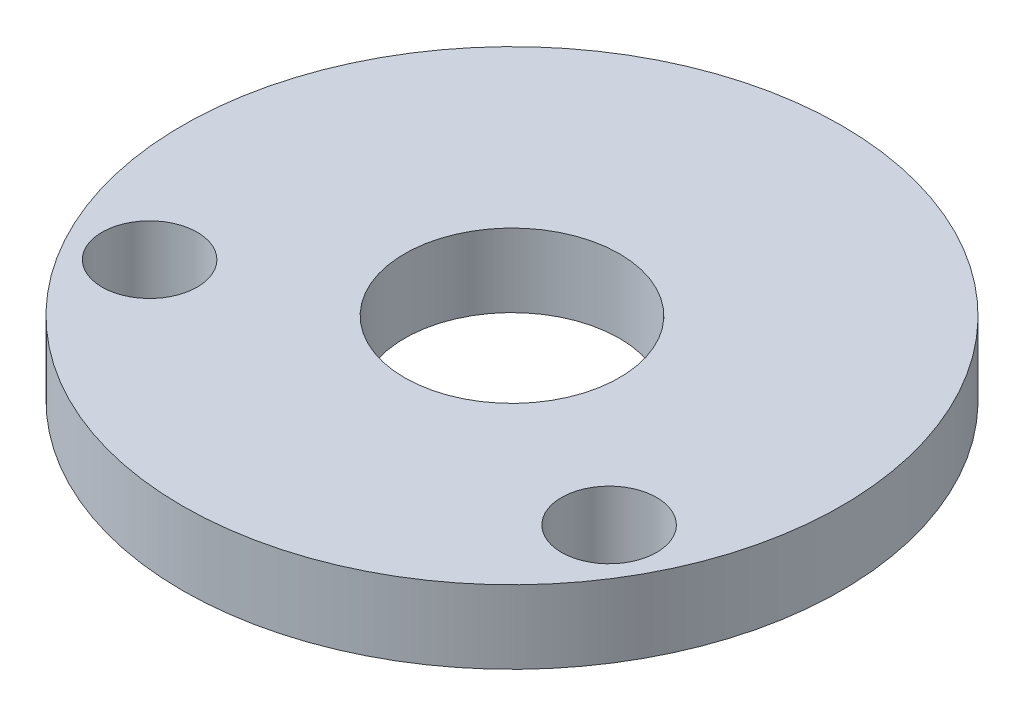
ISO-10303-21;
HEADER;
FILE_DESCRIPTION(('STEP AP214'),'2;1');
FILE_NAME('part.step','',(''),(''),'','','');
FILE_SCHEMA(('AUTOMOTIVE_DESIGN { 1 0 10303 214 1 1 1 1 }'));
ENDSEC;
DATA;
#1=APPLICATION_CONTEXT('core data for automotive mechanical design processes');
#2=APPLICATION_PROTOCOL_DEFINITION('international standard','automotive_design',2000,#1);
#3=PRODUCT_CONTEXT('',#1,'mechanical');
#4=PRODUCT('Part','Part','',(#3));
#5=PRODUCT_RELATED_PRODUCT_CATEGORY('part','',(#4));
#6=PRODUCT_DEFINITION_FORMATION('','',#4);
#7=PRODUCT_DEFINITION_CONTEXT('part definition',#1,'design');
#8=PRODUCT_DEFINITION('design','',#6,#7);
#9=PRODUCT_DEFINITION_SHAPE('','',#8);
#10=(LENGTH_UNIT() NAMED_UNIT(*) SI_UNIT(.MILLI.,.METRE.));
#11=(NAMED_UNIT(*) PLANE_ANGLE_UNIT() SI_UNIT($,.RADIAN.));
#12=(NAMED_UNIT(*) SI_UNIT($,.STERADIAN.) SOLID_ANGLE_UNIT());
#13=UNCERTAINTY_MEASURE_WITH_UNIT(LENGTH_MEASURE(1.E-05),#10,'distance_accuracy_value','');
#14=(GEOMETRIC_REPRESENTATION_CONTEXT(3) GLOBAL_UNCERTAINTY_ASSIGNED_CONTEXT((#13)) GLOBAL_UNIT_ASSIGNED_CONTEXT((#10,
#11,#12)) REPRESENTATION_CONTEXT('',''));
#15=CARTESIAN_POINT('',(0.,0.,0.));
#16=DIRECTION('',(0.,0.,1.));
#17=DIRECTION('',(1.,0.,0.));
#18=AXIS2_PLACEMENT_3D('',#15,#16,#17);
#19=CARTESIAN_POINT('',(-4.70572721581471,26.0989898732233,2.71685287478357));
#20=DIRECTION('',(0.,-1.,0.));
#21=DIRECTION('',(0.,0.,-1.));
#22=AXIS2_PLACEMENT_3D('',#19,#20,#21);
#23=CYLINDRICAL_SURFACE('',#22,0.975);
#24=CARTESIAN_POINT('',(-4.70572721581471,2.8,2.71685287478357));
#25=DIRECTION('',(0.,1.,0.));
#26=DIRECTION('',(0.,0.,1.));
#27=AXIS2_PLACEMENT_3D('',#24,#25,#26);
#28=CIRCLE('',#27,0.975);
#29=CARTESIAN_POINT('',(-4.70572721581471,2.8,3.69185287478357));
#30=VERTEX_POINT('',#29);
#31=EDGE_CURVE('E59',#30,#30,#28,.T.);
#32=ORIENTED_EDGE('',*,*,#31,.F.);
#33=EDGE_LOOP('',(#32));
#34=FACE_BOUND('',#33,.T.);
#35=CARTESIAN_POINT('',(-4.70572721581471,4.3,2.71685287478357));
#36=DIRECTION('',(0.,1.,0.));
#37=DIRECTION('',(0.,0.,1.));
#38=AXIS2_PLACEMENT_3D('',#35,#36,#37);
#39=CIRCLE('',#38,0.975);
#40=CARTESIAN_POINT('',(-4.70572721581471,4.3,3.69185287478357));
#41=VERTEX_POINT('',#40);
#42=EDGE_CURVE('E65',#41,#41,#39,.T.);
#43=ORIENTED_EDGE('',*,*,#42,.T.);
#44=EDGE_LOOP('',(#43));
#45=FACE_BOUND('',#44,.T.);
#46=ADVANCED_FACE('F41',(#34,#45),#23,.F.);
#47=CARTESIAN_POINT('',(0.,26.0989898732233,0.));
#48=DIRECTION('',(0.,-1.,0.));
#49=DIRECTION('',(0.,0.,-1.));
#50=AXIS2_PLACEMENT_3D('',#47,#48,#49);
#51=CYLINDRICAL_SURFACE('',#50,2.2);
#52=CARTESIAN_POINT('',(0.,2.8,0.));
#53=DIRECTION('',(0.,1.,0.));
#54=DIRECTION('',(0.,0.,1.));
#55=AXIS2_PLACEMENT_3D('',#52,#53,#54);
#56=CIRCLE('',#55,2.2);
#57=CARTESIAN_POINT('',(0.,2.8,2.2));
#58=VERTEX_POINT('',#57);
#59=EDGE_CURVE('E54',#58,#58,#56,.T.);
#60=ORIENTED_EDGE('',*,*,#59,.F.);
#61=EDGE_LOOP('',(#60));
#62=FACE_BOUND('',#61,.T.);
#63=CARTESIAN_POINT('',(0.,4.3,0.));
#64=DIRECTION('',(0.,1.,0.));
#65=DIRECTION('',(0.,0.,1.));
#66=AXIS2_PLACEMENT_3D('',#63,#64,#65);
#67=CIRCLE('',#66,2.2);
#68=CARTESIAN_POINT('',(0.,4.3,2.2));
#69=VERTEX_POINT('',#68);
#70=EDGE_CURVE('E74',#69,#69,#67,.T.);
#71=ORIENTED_EDGE('',*,*,#70,.T.);
#72=EDGE_LOOP('',(#71));
#73=FACE_BOUND('',#72,.T.);
#74=ADVANCED_FACE('F91',(#62,#73),#51,.F.);
#75=CARTESIAN_POINT('',(0.,26.0989898732233,0.));
#76=DIRECTION('',(0.,-1.,0.));
#77=DIRECTION('',(0.,0.,-1.));
#78=AXIS2_PLACEMENT_3D('',#75,#76,#77);
#79=CYLINDRICAL_SURFACE('',#78,6.75);
#80=CARTESIAN_POINT('',(0.,2.8,0.));
#81=DIRECTION('',(0.,1.,0.));
#82=DIRECTION('',(0.,0.,1.));
#83=AXIS2_PLACEMENT_3D('',#80,#81,#82);
#84=CIRCLE('',#83,6.75);
#85=CARTESIAN_POINT('',(0.,2.8,6.75));
#86=VERTEX_POINT('',#85);
#87=EDGE_CURVE('E49',#86,#86,#84,.T.);
#88=ORIENTED_EDGE('',*,*,#87,.T.);
#89=EDGE_LOOP('',(#88));
#90=FACE_BOUND('',#89,.T.);
#91=CARTESIAN_POINT('',(0.,4.3,0.));
#92=DIRECTION('',(0.,1.,0.));
#93=DIRECTION('',(0.,0.,1.));
#94=AXIS2_PLACEMENT_3D('',#91,#92,#93);
#95=CIRCLE('',#94,6.75);
#96=CARTESIAN_POINT('',(0.,4.3,6.75));
#97=VERTEX_POINT('',#96);
#98=EDGE_CURVE('E10',#97,#97,#95,.T.);
#99=ORIENTED_EDGE('',*,*,#98,.F.);
#100=EDGE_LOOP('',(#99));
#101=FACE_BOUND('',#100,.T.);
#102=ADVANCED_FACE('F43',(#90,#101),#79,.T.);
#103=CARTESIAN_POINT('',(0.,2.8,0.));
#104=DIRECTION('',(0.,1.,0.));
#105=DIRECTION('',(0.,0.,1.));
#106=AXIS2_PLACEMENT_3D('',#103,#104,#105);
#107=PLANE('',#106);
#108=ORIENTED_EDGE('',*,*,#87,.F.);
#109=EDGE_LOOP('',(#108));
#110=FACE_BOUND('',#109,.T.);
#111=ORIENTED_EDGE('',*,*,#59,.T.);
#112=EDGE_LOOP('',(#111));
#113=FACE_BOUND('',#112,.T.);
#114=ORIENTED_EDGE('',*,*,#31,.T.);
#115=EDGE_LOOP('',(#114));
#116=FACE_BOUND('',#115,.T.);
#117=CARTESIAN_POINT('',(4.70572721581471,2.8,2.71685287478357));
#118=DIRECTION('',(0.,1.,0.));
#119=DIRECTION('',(0.,0.,1.));
#120=AXIS2_PLACEMENT_3D('',#117,#118,#119);
#121=CIRCLE('',#120,0.975000000000001);
#122=CARTESIAN_POINT('',(4.70572721581471,2.8,3.69185287478357));
#123=VERTEX_POINT('',#122);
#124=EDGE_CURVE('E70',#123,#123,#121,.T.);
#125=ORIENTED_EDGE('',*,*,#124,.T.);
#126=EDGE_LOOP('',(#125));
#127=FACE_BOUND('',#126,.T.);
#128=ADVANCED_FACE('F99',(#110,#113,#116,#127),#107,.F.);
#129=CARTESIAN_POINT('',(4.70572721581471,26.0989898732233,2.71685287478357));
#130=DIRECTION('',(0.,-1.,0.));
#131=DIRECTION('',(0.,0.,-1.));
#132=AXIS2_PLACEMENT_3D('',#129,#130,#131);
#133=CYLINDRICAL_SURFACE('',#132,0.975000000000001);
#134=ORIENTED_EDGE('',*,*,#124,.F.);
#135=EDGE_LOOP('',(#134));
#136=FACE_BOUND('',#135,.T.);
#137=CARTESIAN_POINT('',(4.70572721581471,4.3,2.71685287478357));
#138=DIRECTION('',(0.,1.,0.));
#139=DIRECTION('',(0.,0.,1.));
#140=AXIS2_PLACEMENT_3D('',#137,#138,#139);
#141=CIRCLE('',#140,0.975000000000001);
#142=CARTESIAN_POINT('',(4.70572721581471,4.3,3.69185287478357));
#143=VERTEX_POINT('',#142);
#144=EDGE_CURVE('E62',#143,#143,#141,.T.);
#145=ORIENTED_EDGE('',*,*,#144,.T.);
#146=EDGE_LOOP('',(#145));
#147=FACE_BOUND('',#146,.T.);
#148=ADVANCED_FACE('F86',(#136,#147),#133,.F.);
#149=CARTESIAN_POINT('',(0.,4.3,0.));
#150=DIRECTION('',(0.,1.,0.));
#151=DIRECTION('',(0.,0.,1.));
#152=AXIS2_PLACEMENT_3D('',#149,#150,#151);
#153=PLANE('',#152);
#154=ORIENTED_EDGE('',*,*,#144,.F.);
#155=EDGE_LOOP('',(#154));
#156=FACE_BOUND('',#155,.T.);
#157=ORIENTED_EDGE('',*,*,#42,.F.);
#158=EDGE_LOOP('',(#157));
#159=FACE_BOUND('',#158,.T.);
#160=ORIENTED_EDGE('',*,*,#70,.F.);
#161=EDGE_LOOP('',(#160));
#162=FACE_BOUND('',#161,.T.);
#163=ORIENTED_EDGE('',*,*,#98,.T.);
#164=EDGE_LOOP('',(#163));
#165=FACE_BOUND('',#164,.T.);
#166=ADVANCED_FACE('F83',(#156,#159,#162,#165),#153,.T.);
#167=CLOSED_SHELL('',(#46,#74,#102,#128,#148,#166));
#168=MANIFOLD_SOLID_BREP('B2',#167);
#169=ADVANCED_BREP_SHAPE_REPRESENTATION('',(#18,#168),#14);
#170=SHAPE_DEFINITION_REPRESENTATION(#9,#169);
ENDSEC;
END-ISO-10303-21;
